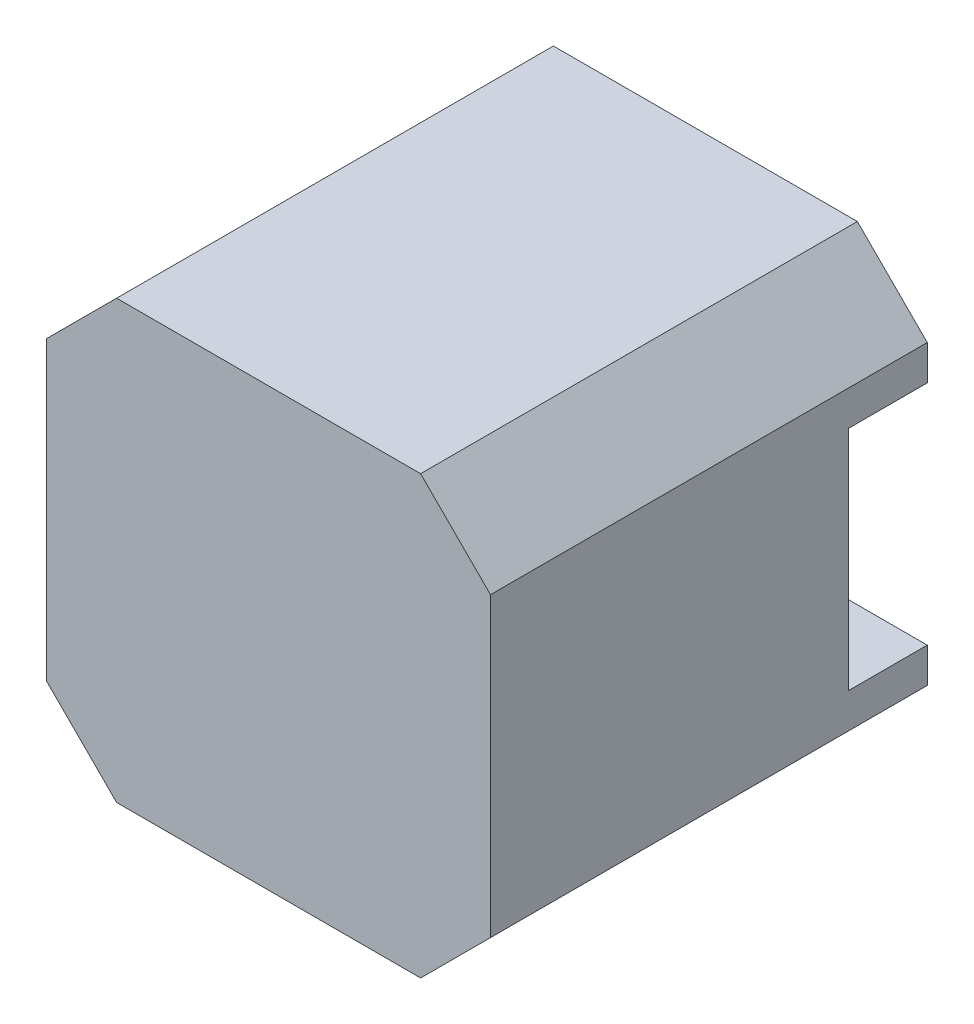
ISO-10303-21;
HEADER;
FILE_DESCRIPTION(('STEP AP214'),'2;1');
FILE_NAME('part.step','',(''),(''),'','','');
FILE_SCHEMA(('AUTOMOTIVE_DESIGN { 1 0 10303 214 1 1 1 1 }'));
ENDSEC;
DATA;
#1=APPLICATION_CONTEXT('core data for automotive mechanical design processes');
#2=APPLICATION_PROTOCOL_DEFINITION('international standard','automotive_design',2000,#1);
#3=PRODUCT_CONTEXT('',#1,'mechanical');
#4=PRODUCT('Part','Part','',(#3));
#5=PRODUCT_RELATED_PRODUCT_CATEGORY('part','',(#4));
#6=PRODUCT_DEFINITION_FORMATION('','',#4);
#7=PRODUCT_DEFINITION_CONTEXT('part definition',#1,'design');
#8=PRODUCT_DEFINITION('design','',#6,#7);
#9=PRODUCT_DEFINITION_SHAPE('','',#8);
#10=(LENGTH_UNIT() NAMED_UNIT(*) SI_UNIT(.MILLI.,.METRE.));
#11=(NAMED_UNIT(*) PLANE_ANGLE_UNIT() SI_UNIT($,.RADIAN.));
#12=(NAMED_UNIT(*) SI_UNIT($,.STERADIAN.) SOLID_ANGLE_UNIT());
#13=UNCERTAINTY_MEASURE_WITH_UNIT(LENGTH_MEASURE(1.E-05),#10,'distance_accuracy_value','');
#14=(GEOMETRIC_REPRESENTATION_CONTEXT(3) GLOBAL_UNCERTAINTY_ASSIGNED_CONTEXT((#13)) GLOBAL_UNIT_ASSIGNED_CONTEXT((#10,
#11,#12)) REPRESENTATION_CONTEXT('',''));
#15=CARTESIAN_POINT('',(0.,0.,0.));
#16=DIRECTION('',(0.,0.,1.));
#17=DIRECTION('',(1.,0.,0.));
#18=AXIS2_PLACEMENT_3D('',#15,#16,#17);
#19=CARTESIAN_POINT('',(-7.46,1.9,0.45));
#20=DIRECTION('',(0.,0.,1.));
#21=DIRECTION('',(0.,-1.,0.));
#22=AXIS2_PLACEMENT_3D('',#19,#20,#21);
#23=PLANE('',#22);
#24=DIRECTION('',(0.,1.,0.));
#25=VECTOR('',#24,1.);
#26=CARTESIAN_POINT('',(2.54,0.,0.45));
#27=LINE('',#26,#25);
#28=CARTESIAN_POINT('',(2.54,1.9,0.45));
#29=VERTEX_POINT('',#28);
#30=CARTESIAN_POINT('',(2.54,0.6,0.45));
#31=VERTEX_POINT('',#30);
#32=EDGE_CURVE('E104',#29,#31,#27,.F.);
#33=ORIENTED_EDGE('',*,*,#32,.T.);
#34=DIRECTION('',(1.,0.,0.));
#35=VECTOR('',#34,1.);
#36=CARTESIAN_POINT('',(-7.46,0.6,0.45));
#37=LINE('',#36,#35);
#38=CARTESIAN_POINT('',(0.,0.6,0.45));
#39=VERTEX_POINT('',#38);
#40=EDGE_CURVE('E188',#31,#39,#37,.F.);
#41=ORIENTED_EDGE('',*,*,#40,.T.);
#42=DIRECTION('',(0.,-1.,0.));
#43=VECTOR('',#42,1.);
#44=CARTESIAN_POINT('',(0.,1.9,0.45));
#45=LINE('',#44,#43);
#46=CARTESIAN_POINT('',(0.,1.9,0.45));
#47=VERTEX_POINT('',#46);
#48=EDGE_CURVE('E20',#47,#39,#45,.T.);
#49=ORIENTED_EDGE('',*,*,#48,.F.);
#50=DIRECTION('',(1.,0.,0.));
#51=VECTOR('',#50,1.);
#52=CARTESIAN_POINT('',(-7.46,1.9,0.45));
#53=LINE('',#52,#51);
#54=EDGE_CURVE('E107',#47,#29,#53,.T.);
#55=ORIENTED_EDGE('',*,*,#54,.T.);
#56=EDGE_LOOP('',(#33,#41,#49,#55));
#57=FACE_BOUND('',#56,.T.);
#58=ADVANCED_FACE('F17',(#57),#23,.F.);
#59=CARTESIAN_POINT('',(-7.46,1.9,0.45));
#60=DIRECTION('',(0.,1.,0.));
#61=DIRECTION('',(0.,0.,1.));
#62=AXIS2_PLACEMENT_3D('',#59,#60,#61);
#63=PLANE('',#62);
#64=DIRECTION('',(0.,0.,1.));
#65=VECTOR('',#64,1.);
#66=CARTESIAN_POINT('',(2.54,1.9,2.5));
#67=LINE('',#66,#65);
#68=CARTESIAN_POINT('',(2.54,1.9,0.));
#69=VERTEX_POINT('',#68);
#70=EDGE_CURVE('E117',#69,#29,#67,.T.);
#71=ORIENTED_EDGE('',*,*,#70,.T.);
#72=ORIENTED_EDGE('',*,*,#54,.F.);
#73=DIRECTION('',(0.,0.,-1.));
#74=VECTOR('',#73,1.);
#75=CARTESIAN_POINT('',(0.,1.9,2.5));
#76=LINE('',#75,#74);
#77=CARTESIAN_POINT('',(0.,1.9,0.));
#78=VERTEX_POINT('',#77);
#79=EDGE_CURVE('E181',#47,#78,#76,.T.);
#80=ORIENTED_EDGE('',*,*,#79,.T.);
#81=DIRECTION('',(-1.,0.,0.));
#82=VECTOR('',#81,1.);
#83=CARTESIAN_POINT('',(0.,1.9,0.));
#84=LINE('',#83,#82);
#85=EDGE_CURVE('E124',#69,#78,#84,.T.);
#86=ORIENTED_EDGE('',*,*,#85,.F.);
#87=EDGE_LOOP('',(#71,#72,#80,#86));
#88=FACE_BOUND('',#87,.T.);
#89=ADVANCED_FACE('F123',(#88),#63,.F.);
#90=CARTESIAN_POINT('',(2.54,0.,2.5));
#91=DIRECTION('',(-1.,0.,0.));
#92=DIRECTION('',(0.,0.,1.));
#93=AXIS2_PLACEMENT_3D('',#90,#91,#92);
#94=PLANE('',#93);
#95=ORIENTED_EDGE('',*,*,#70,.F.);
#96=DIRECTION('',(0.,1.,0.));
#97=VECTOR('',#96,1.);
#98=CARTESIAN_POINT('',(2.54,2.5,0.));
#99=LINE('',#98,#97);
#100=CARTESIAN_POINT('',(2.54,2.1,0.));
#101=VERTEX_POINT('',#100);
#102=EDGE_CURVE('E148',#101,#69,#99,.F.);
#103=ORIENTED_EDGE('',*,*,#102,.F.);
#104=DIRECTION('',(0.,0.,1.));
#105=VECTOR('',#104,1.);
#106=CARTESIAN_POINT('',(2.54,2.1,2.5));
#107=LINE('',#106,#105);
#108=CARTESIAN_POINT('',(2.54,2.1,2.5));
#109=VERTEX_POINT('',#108);
#110=EDGE_CURVE('E179',#101,#109,#107,.T.);
#111=ORIENTED_EDGE('',*,*,#110,.T.);
#112=DIRECTION('',(0.,1.,0.));
#113=VECTOR('',#112,1.);
#114=CARTESIAN_POINT('',(2.54,0.,2.5));
#115=LINE('',#114,#113);
#116=CARTESIAN_POINT('',(2.54,0.4,2.5));
#117=VERTEX_POINT('',#116);
#118=EDGE_CURVE('E125',#117,#109,#115,.T.);
#119=ORIENTED_EDGE('',*,*,#118,.F.);
#120=DIRECTION('',(0.,0.,1.));
#121=VECTOR('',#120,1.);
#122=CARTESIAN_POINT('',(2.54,0.4,2.5));
#123=LINE('',#122,#121);
#124=CARTESIAN_POINT('',(2.54,0.4,0.));
#125=VERTEX_POINT('',#124);
#126=EDGE_CURVE('E143',#117,#125,#123,.F.);
#127=ORIENTED_EDGE('',*,*,#126,.T.);
#128=DIRECTION('',(0.,1.,0.));
#129=VECTOR('',#128,1.);
#130=CARTESIAN_POINT('',(2.54,0.,0.));
#131=LINE('',#130,#129);
#132=CARTESIAN_POINT('',(2.54,0.6,0.));
#133=VERTEX_POINT('',#132);
#134=EDGE_CURVE('E112',#133,#125,#131,.F.);
#135=ORIENTED_EDGE('',*,*,#134,.F.);
#136=DIRECTION('',(0.,0.,-1.));
#137=VECTOR('',#136,1.);
#138=CARTESIAN_POINT('',(2.54,0.6,0.45));
#139=LINE('',#138,#137);
#140=EDGE_CURVE('E120',#133,#31,#139,.F.);
#141=ORIENTED_EDGE('',*,*,#140,.T.);
#142=ORIENTED_EDGE('',*,*,#32,.F.);
#143=EDGE_LOOP('',(#95,#103,#111,#119,#127,#135,#141,#142));
#144=FACE_BOUND('',#143,.T.);
#145=ADVANCED_FACE('F115',(#144),#94,.F.);
#146=CARTESIAN_POINT('',(-7.46,0.6,0.45));
#147=DIRECTION('',(0.,-1.,0.));
#148=DIRECTION('',(0.,0.,-1.));
#149=AXIS2_PLACEMENT_3D('',#146,#147,#148);
#150=PLANE('',#149);
#151=ORIENTED_EDGE('',*,*,#140,.F.);
#152=DIRECTION('',(-1.,0.,0.));
#153=VECTOR('',#152,1.);
#154=CARTESIAN_POINT('',(0.,0.6,0.));
#155=LINE('',#154,#153);
#156=CARTESIAN_POINT('',(0.,0.6,0.));
#157=VERTEX_POINT('',#156);
#158=EDGE_CURVE('E141',#157,#133,#155,.F.);
#159=ORIENTED_EDGE('',*,*,#158,.F.);
#160=DIRECTION('',(0.,0.,-1.));
#161=VECTOR('',#160,1.);
#162=CARTESIAN_POINT('',(0.,0.6,2.5));
#163=LINE('',#162,#161);
#164=EDGE_CURVE('E183',#157,#39,#163,.F.);
#165=ORIENTED_EDGE('',*,*,#164,.T.);
#166=ORIENTED_EDGE('',*,*,#40,.F.);
#167=EDGE_LOOP('',(#151,#159,#165,#166));
#168=FACE_BOUND('',#167,.T.);
#169=ADVANCED_FACE('F190',(#168),#150,.F.);
#170=CARTESIAN_POINT('',(0.,0.,2.5));
#171=DIRECTION('',(1.,0.,0.));
#172=DIRECTION('',(0.,0.,-1.));
#173=AXIS2_PLACEMENT_3D('',#170,#171,#172);
#174=PLANE('',#173);
#175=ORIENTED_EDGE('',*,*,#79,.F.);
#176=ORIENTED_EDGE('',*,*,#48,.T.);
#177=ORIENTED_EDGE('',*,*,#164,.F.);
#178=DIRECTION('',(0.,1.,0.));
#179=VECTOR('',#178,1.);
#180=CARTESIAN_POINT('',(0.,2.5,0.));
#181=LINE('',#180,#179);
#182=CARTESIAN_POINT('',(0.,0.4,0.));
#183=VERTEX_POINT('',#182);
#184=EDGE_CURVE('E154',#183,#157,#181,.T.);
#185=ORIENTED_EDGE('',*,*,#184,.F.);
#186=DIRECTION('',(0.,0.,1.));
#187=VECTOR('',#186,1.);
#188=CARTESIAN_POINT('',(0.,0.4,2.5));
#189=LINE('',#188,#187);
#190=CARTESIAN_POINT('',(0.,0.4,2.5));
#191=VERTEX_POINT('',#190);
#192=EDGE_CURVE('E198',#183,#191,#189,.T.);
#193=ORIENTED_EDGE('',*,*,#192,.T.);
#194=DIRECTION('',(0.,1.,0.));
#195=VECTOR('',#194,1.);
#196=CARTESIAN_POINT('',(0.,0.,2.5));
#197=LINE('',#196,#195);
#198=CARTESIAN_POINT('',(0.,2.1,2.5));
#199=VERTEX_POINT('',#198);
#200=EDGE_CURVE('E186',#199,#191,#197,.F.);
#201=ORIENTED_EDGE('',*,*,#200,.F.);
#202=DIRECTION('',(0.,0.,1.));
#203=VECTOR('',#202,1.);
#204=CARTESIAN_POINT('',(0.,2.1,2.5));
#205=LINE('',#204,#203);
#206=CARTESIAN_POINT('',(0.,2.1,0.));
#207=VERTEX_POINT('',#206);
#208=EDGE_CURVE('E174',#199,#207,#205,.F.);
#209=ORIENTED_EDGE('',*,*,#208,.T.);
#210=DIRECTION('',(0.,1.,0.));
#211=VECTOR('',#210,1.);
#212=CARTESIAN_POINT('',(0.,2.5,0.));
#213=LINE('',#212,#211);
#214=EDGE_CURVE('E168',#78,#207,#213,.T.);
#215=ORIENTED_EDGE('',*,*,#214,.F.);
#216=EDGE_LOOP('',(#175,#176,#177,#185,#193,#201,#209,#215));
#217=FACE_BOUND('',#216,.T.);
#218=ADVANCED_FACE('F192',(#217),#174,.F.);
#219=CARTESIAN_POINT('',(2.14,2.5,2.5));
#220=DIRECTION('',(-0.707106781186548,-0.707106781186548,0.));
#221=DIRECTION('',(0.707106781186548,-0.707106781186548,0.));
#222=AXIS2_PLACEMENT_3D('',#219,#220,#221);
#223=PLANE('',#222);
#224=ORIENTED_EDGE('',*,*,#110,.F.);
#225=DIRECTION('',(0.707106781186548,-0.707106781186547,0.));
#226=VECTOR('',#225,1.);
#227=CARTESIAN_POINT('',(2.14,2.5,0.));
#228=LINE('',#227,#226);
#229=CARTESIAN_POINT('',(2.14,2.5,0.));
#230=VERTEX_POINT('',#229);
#231=EDGE_CURVE('E163',#230,#101,#228,.T.);
#232=ORIENTED_EDGE('',*,*,#231,.F.);
#233=DIRECTION('',(0.,0.,1.));
#234=VECTOR('',#233,1.);
#235=CARTESIAN_POINT('',(2.14,2.5,2.5));
#236=LINE('',#235,#234);
#237=CARTESIAN_POINT('',(2.14,2.5,2.5));
#238=VERTEX_POINT('',#237);
#239=EDGE_CURVE('E202',#230,#238,#236,.T.);
#240=ORIENTED_EDGE('',*,*,#239,.T.);
#241=DIRECTION('',(0.707106781186548,-0.707106781186548,0.));
#242=VECTOR('',#241,1.);
#243=CARTESIAN_POINT('',(2.14,2.5,2.5));
#244=LINE('',#243,#242);
#245=EDGE_CURVE('E177',#109,#238,#244,.F.);
#246=ORIENTED_EDGE('',*,*,#245,.F.);
#247=EDGE_LOOP('',(#224,#232,#240,#246));
#248=FACE_BOUND('',#247,.T.);
#249=ADVANCED_FACE('F225',(#248),#223,.F.);
#250=CARTESIAN_POINT('',(0.,2.1,2.5));
#251=DIRECTION('',(0.707106781186548,-0.707106781186548,0.));
#252=DIRECTION('',(0.707106781186548,0.707106781186548,0.));
#253=AXIS2_PLACEMENT_3D('',#250,#251,#252);
#254=PLANE('',#253);
#255=DIRECTION('',(0.,0.,1.));
#256=VECTOR('',#255,1.);
#257=CARTESIAN_POINT('',(0.4,2.5,2.5));
#258=LINE('',#257,#256);
#259=CARTESIAN_POINT('',(0.4,2.5,2.5));
#260=VERTEX_POINT('',#259);
#261=CARTESIAN_POINT('',(0.4,2.5,0.));
#262=VERTEX_POINT('',#261);
#263=EDGE_CURVE('E205',#260,#262,#258,.F.);
#264=ORIENTED_EDGE('',*,*,#263,.T.);
#265=DIRECTION('',(0.707106781186548,0.707106781186547,0.));
#266=VECTOR('',#265,1.);
#267=CARTESIAN_POINT('',(0.,2.1,0.));
#268=LINE('',#267,#266);
#269=EDGE_CURVE('E166',#207,#262,#268,.T.);
#270=ORIENTED_EDGE('',*,*,#269,.F.);
#271=ORIENTED_EDGE('',*,*,#208,.F.);
#272=DIRECTION('',(0.707106781186548,0.707106781186548,0.));
#273=VECTOR('',#272,1.);
#274=CARTESIAN_POINT('',(0.,2.1,2.5));
#275=LINE('',#274,#273);
#276=EDGE_CURVE('E171',#260,#199,#275,.F.);
#277=ORIENTED_EDGE('',*,*,#276,.F.);
#278=EDGE_LOOP('',(#264,#270,#271,#277));
#279=FACE_BOUND('',#278,.T.);
#280=ADVANCED_FACE('F230',(#279),#254,.F.);
#281=CARTESIAN_POINT('',(0.,2.5,0.));
#282=DIRECTION('',(0.,0.,-1.));
#283=DIRECTION('',(-1.,0.,0.));
#284=AXIS2_PLACEMENT_3D('',#281,#282,#283);
#285=PLANE('',#284);
#286=ORIENTED_EDGE('',*,*,#231,.T.);
#287=ORIENTED_EDGE('',*,*,#102,.T.);
#288=ORIENTED_EDGE('',*,*,#85,.T.);
#289=ORIENTED_EDGE('',*,*,#214,.T.);
#290=ORIENTED_EDGE('',*,*,#269,.T.);
#291=DIRECTION('',(1.,0.,0.));
#292=VECTOR('',#291,1.);
#293=CARTESIAN_POINT('',(0.,2.5,0.));
#294=LINE('',#293,#292);
#295=EDGE_CURVE('E208',#262,#230,#294,.T.);
#296=ORIENTED_EDGE('',*,*,#295,.T.);
#297=EDGE_LOOP('',(#286,#287,#288,#289,#290,#296));
#298=FACE_BOUND('',#297,.T.);
#299=ADVANCED_FACE('F227',(#298),#285,.T.);
#300=CARTESIAN_POINT('',(2.54,0.4,2.5));
#301=DIRECTION('',(-0.707106781186548,0.707106781186548,0.));
#302=DIRECTION('',(-0.707106781186548,-0.707106781186548,0.));
#303=AXIS2_PLACEMENT_3D('',#300,#301,#302);
#304=PLANE('',#303);
#305=DIRECTION('',(0.,0.,1.));
#306=VECTOR('',#305,1.);
#307=CARTESIAN_POINT('',(2.14,0.,2.5));
#308=LINE('',#307,#306);
#309=CARTESIAN_POINT('',(2.14,0.,2.5));
#310=VERTEX_POINT('',#309);
#311=CARTESIAN_POINT('',(2.14,0.,0.));
#312=VERTEX_POINT('',#311);
#313=EDGE_CURVE('E153',#310,#312,#308,.F.);
#314=ORIENTED_EDGE('',*,*,#313,.T.);
#315=DIRECTION('',(-0.707106781186548,-0.707106781186548,0.));
#316=VECTOR('',#315,1.);
#317=CARTESIAN_POINT('',(2.54,0.4,0.));
#318=LINE('',#317,#316);
#319=EDGE_CURVE('E137',#125,#312,#318,.T.);
#320=ORIENTED_EDGE('',*,*,#319,.F.);
#321=ORIENTED_EDGE('',*,*,#126,.F.);
#322=DIRECTION('',(-0.707106781186548,-0.707106781186548,0.));
#323=VECTOR('',#322,1.);
#324=CARTESIAN_POINT('',(2.54,0.4,2.5));
#325=LINE('',#324,#323);
#326=EDGE_CURVE('E147',#310,#117,#325,.F.);
#327=ORIENTED_EDGE('',*,*,#326,.F.);
#328=EDGE_LOOP('',(#314,#320,#321,#327));
#329=FACE_BOUND('',#328,.T.);
#330=ADVANCED_FACE('F151',(#329),#304,.F.);
#331=CARTESIAN_POINT('',(0.,2.5,0.));
#332=DIRECTION('',(0.,0.,-1.));
#333=DIRECTION('',(-1.,0.,0.));
#334=AXIS2_PLACEMENT_3D('',#331,#332,#333);
#335=PLANE('',#334);
#336=DIRECTION('',(-0.707106781186548,0.707106781186548,0.));
#337=VECTOR('',#336,1.);
#338=CARTESIAN_POINT('',(0.4,0.,0.));
#339=LINE('',#338,#337);
#340=CARTESIAN_POINT('',(0.4,0.,0.));
#341=VERTEX_POINT('',#340);
#342=EDGE_CURVE('E156',#341,#183,#339,.T.);
#343=ORIENTED_EDGE('',*,*,#342,.T.);
#344=ORIENTED_EDGE('',*,*,#184,.T.);
#345=ORIENTED_EDGE('',*,*,#158,.T.);
#346=ORIENTED_EDGE('',*,*,#134,.T.);
#347=ORIENTED_EDGE('',*,*,#319,.T.);
#348=DIRECTION('',(1.,0.,0.));
#349=VECTOR('',#348,1.);
#350=CARTESIAN_POINT('',(0.,0.,0.));
#351=LINE('',#350,#349);
#352=EDGE_CURVE('E195',#312,#341,#351,.F.);
#353=ORIENTED_EDGE('',*,*,#352,.T.);
#354=EDGE_LOOP('',(#343,#344,#345,#346,#347,#353));
#355=FACE_BOUND('',#354,.T.);
#356=ADVANCED_FACE('F134',(#355),#335,.T.);
#357=CARTESIAN_POINT('',(0.4,0.,2.5));
#358=DIRECTION('',(0.707106781186548,0.707106781186548,0.));
#359=DIRECTION('',(-0.707106781186548,0.707106781186548,0.));
#360=AXIS2_PLACEMENT_3D('',#357,#358,#359);
#361=PLANE('',#360);
#362=ORIENTED_EDGE('',*,*,#192,.F.);
#363=ORIENTED_EDGE('',*,*,#342,.F.);
#364=DIRECTION('',(0.,0.,1.));
#365=VECTOR('',#364,1.);
#366=CARTESIAN_POINT('',(0.4,0.,2.5));
#367=LINE('',#366,#365);
#368=CARTESIAN_POINT('',(0.4,0.,2.5));
#369=VERTEX_POINT('',#368);
#370=EDGE_CURVE('E213',#341,#369,#367,.T.);
#371=ORIENTED_EDGE('',*,*,#370,.T.);
#372=DIRECTION('',(-0.707106781186548,0.707106781186548,0.));
#373=VECTOR('',#372,1.);
#374=CARTESIAN_POINT('',(0.4,0.,2.5));
#375=LINE('',#374,#373);
#376=EDGE_CURVE('E35',#191,#369,#375,.F.);
#377=ORIENTED_EDGE('',*,*,#376,.F.);
#378=EDGE_LOOP('',(#362,#363,#371,#377));
#379=FACE_BOUND('',#378,.T.);
#380=ADVANCED_FACE('F233',(#379),#361,.F.);
#381=CARTESIAN_POINT('',(0.,2.5,2.5));
#382=DIRECTION('',(0.,-1.,0.));
#383=DIRECTION('',(1.,0.,0.));
#384=AXIS2_PLACEMENT_3D('',#381,#382,#383);
#385=PLANE('',#384);
#386=ORIENTED_EDGE('',*,*,#263,.F.);
#387=DIRECTION('',(-1.,0.,0.));
#388=VECTOR('',#387,1.);
#389=CARTESIAN_POINT('',(0.,2.5,2.5));
#390=LINE('',#389,#388);
#391=EDGE_CURVE('E26',#260,#238,#390,.F.);
#392=ORIENTED_EDGE('',*,*,#391,.T.);
#393=ORIENTED_EDGE('',*,*,#239,.F.);
#394=ORIENTED_EDGE('',*,*,#295,.F.);
#395=EDGE_LOOP('',(#386,#392,#393,#394));
#396=FACE_BOUND('',#395,.T.);
#397=ADVANCED_FACE('F219',(#396),#385,.F.);
#398=CARTESIAN_POINT('',(0.,0.,2.5));
#399=DIRECTION('',(0.,1.,0.));
#400=DIRECTION('',(0.,0.,1.));
#401=AXIS2_PLACEMENT_3D('',#398,#399,#400);
#402=PLANE('',#401);
#403=ORIENTED_EDGE('',*,*,#370,.F.);
#404=ORIENTED_EDGE('',*,*,#352,.F.);
#405=ORIENTED_EDGE('',*,*,#313,.F.);
#406=DIRECTION('',(-1.,0.,0.));
#407=VECTOR('',#406,1.);
#408=CARTESIAN_POINT('',(0.,0.,2.5));
#409=LINE('',#408,#407);
#410=EDGE_CURVE('E11',#310,#369,#409,.T.);
#411=ORIENTED_EDGE('',*,*,#410,.T.);
#412=EDGE_LOOP('',(#403,#404,#405,#411));
#413=FACE_BOUND('',#412,.T.);
#414=ADVANCED_FACE('F235',(#413),#402,.F.);
#415=CARTESIAN_POINT('',(0.,2.5,2.5));
#416=DIRECTION('',(0.,0.,-1.));
#417=DIRECTION('',(-1.,0.,0.));
#418=AXIS2_PLACEMENT_3D('',#415,#416,#417);
#419=PLANE('',#418);
#420=ORIENTED_EDGE('',*,*,#376,.T.);
#421=ORIENTED_EDGE('',*,*,#410,.F.);
#422=ORIENTED_EDGE('',*,*,#326,.T.);
#423=ORIENTED_EDGE('',*,*,#118,.T.);
#424=ORIENTED_EDGE('',*,*,#245,.T.);
#425=ORIENTED_EDGE('',*,*,#391,.F.);
#426=ORIENTED_EDGE('',*,*,#276,.T.);
#427=ORIENTED_EDGE('',*,*,#200,.T.);
#428=EDGE_LOOP('',(#420,#421,#422,#423,#424,#425,#426,#427));
#429=FACE_BOUND('',#428,.T.);
#430=ADVANCED_FACE('F222',(#429),#419,.F.);
#431=CLOSED_SHELL('',(#58,#89,#145,#169,#218,#249,#280,#299,#330,#356,#380,#397,#414,#430));
#432=MANIFOLD_SOLID_BREP('B1',#431);
#433=ADVANCED_BREP_SHAPE_REPRESENTATION('',(#18,#432),#14);
#434=SHAPE_DEFINITION_REPRESENTATION(#9,#433);
ENDSEC;
END-ISO-10303-21;
